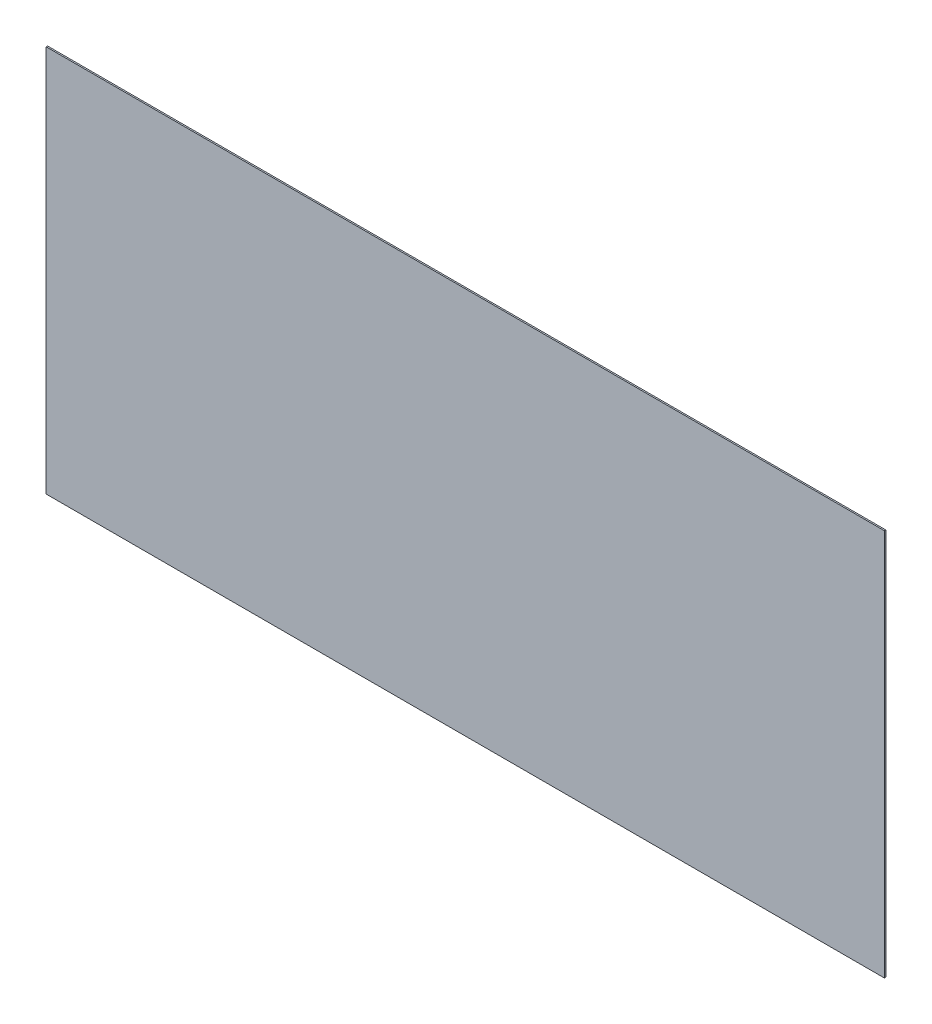
ISO-10303-21;
HEADER;
FILE_DESCRIPTION(('STEP AP214'),'2;1');
FILE_NAME('part.step','',(''),(''),'','','');
FILE_SCHEMA(('AUTOMOTIVE_DESIGN { 1 0 10303 214 1 1 1 1 }'));
ENDSEC;
DATA;
#1=APPLICATION_CONTEXT('core data for automotive mechanical design processes');
#2=APPLICATION_PROTOCOL_DEFINITION('international standard','automotive_design',2000,#1);
#3=PRODUCT_CONTEXT('',#1,'mechanical');
#4=PRODUCT('Part','Part','',(#3));
#5=PRODUCT_RELATED_PRODUCT_CATEGORY('part','',(#4));
#6=PRODUCT_DEFINITION_FORMATION('','',#4);
#7=PRODUCT_DEFINITION_CONTEXT('part definition',#1,'design');
#8=PRODUCT_DEFINITION('design','',#6,#7);
#9=PRODUCT_DEFINITION_SHAPE('','',#8);
#10=(LENGTH_UNIT() NAMED_UNIT(*) SI_UNIT(.MILLI.,.METRE.));
#11=(NAMED_UNIT(*) PLANE_ANGLE_UNIT() SI_UNIT($,.RADIAN.));
#12=(NAMED_UNIT(*) SI_UNIT($,.STERADIAN.) SOLID_ANGLE_UNIT());
#13=UNCERTAINTY_MEASURE_WITH_UNIT(LENGTH_MEASURE(1.E-05),#10,'distance_accuracy_value','');
#14=(GEOMETRIC_REPRESENTATION_CONTEXT(3) GLOBAL_UNCERTAINTY_ASSIGNED_CONTEXT((#13)) GLOBAL_UNIT_ASSIGNED_CONTEXT((#10,
#11,#12)) REPRESENTATION_CONTEXT('',''));
#15=CARTESIAN_POINT('',(0.,0.,0.));
#16=DIRECTION('',(0.,0.,1.));
#17=DIRECTION('',(1.,0.,0.));
#18=AXIS2_PLACEMENT_3D('',#15,#16,#17);
#19=CARTESIAN_POINT('',(16.,35.25,0.1));
#20=DIRECTION('',(1.,0.,0.));
#21=DIRECTION('',(0.,1.,0.));
#22=AXIS2_PLACEMENT_3D('',#19,#20,#21);
#23=PLANE('',#22);
#24=DIRECTION('',(0.,-1.,0.));
#25=VECTOR('',#24,1.);
#26=CARTESIAN_POINT('',(16.,35.25,0.));
#27=LINE('',#26,#25);
#28=CARTESIAN_POINT('',(16.,35.25,0.));
#29=VERTEX_POINT('',#28);
#30=CARTESIAN_POINT('',(16.,7.75000000000002,0.));
#31=VERTEX_POINT('',#30);
#32=EDGE_CURVE('E104',#29,#31,#27,.T.);
#33=ORIENTED_EDGE('',*,*,#32,.T.);
#34=DIRECTION('',(0.,0.,-1.));
#35=VECTOR('',#34,1.);
#36=CARTESIAN_POINT('',(16.,7.75000000000002,0.1));
#37=LINE('',#36,#35);
#38=CARTESIAN_POINT('',(16.,7.75000000000002,0.1));
#39=VERTEX_POINT('',#38);
#40=EDGE_CURVE('E11',#39,#31,#37,.T.);
#41=ORIENTED_EDGE('',*,*,#40,.F.);
#42=DIRECTION('',(0.,-1.,0.));
#43=VECTOR('',#42,1.);
#44=CARTESIAN_POINT('',(16.,35.25,0.1));
#45=LINE('',#44,#43);
#46=CARTESIAN_POINT('',(16.,35.25,0.1));
#47=VERTEX_POINT('',#46);
#48=EDGE_CURVE('E92',#47,#39,#45,.T.);
#49=ORIENTED_EDGE('',*,*,#48,.F.);
#50=DIRECTION('',(0.,0.,-1.));
#51=VECTOR('',#50,1.);
#52=CARTESIAN_POINT('',(16.,35.25,0.1));
#53=LINE('',#52,#51);
#54=EDGE_CURVE('E100',#47,#29,#53,.T.);
#55=ORIENTED_EDGE('',*,*,#54,.T.);
#56=EDGE_LOOP('',(#33,#41,#49,#55));
#57=FACE_BOUND('',#56,.T.);
#58=ADVANCED_FACE('F41',(#57),#23,.F.);
#59=CARTESIAN_POINT('',(16.,7.75000000000002,0.1));
#60=DIRECTION('',(0.,1.,0.));
#61=DIRECTION('',(0.,0.,1.));
#62=AXIS2_PLACEMENT_3D('',#59,#60,#61);
#63=PLANE('',#62);
#64=DIRECTION('',(1.,0.,0.));
#65=VECTOR('',#64,1.);
#66=CARTESIAN_POINT('',(16.,7.75000000000002,0.));
#67=LINE('',#66,#65);
#68=CARTESIAN_POINT('',(75.5,7.75000000000002,0.));
#69=VERTEX_POINT('',#68);
#70=EDGE_CURVE('E96',#31,#69,#67,.T.);
#71=ORIENTED_EDGE('',*,*,#70,.T.);
#72=DIRECTION('',(0.,0.,-1.));
#73=VECTOR('',#72,1.);
#74=CARTESIAN_POINT('',(75.5,7.75000000000002,0.1));
#75=LINE('',#74,#73);
#76=CARTESIAN_POINT('',(75.5,7.75000000000002,0.1));
#77=VERTEX_POINT('',#76);
#78=EDGE_CURVE('E49',#77,#69,#75,.T.);
#79=ORIENTED_EDGE('',*,*,#78,.F.);
#80=DIRECTION('',(1.,0.,0.));
#81=VECTOR('',#80,1.);
#82=CARTESIAN_POINT('',(16.,7.75000000000002,0.1));
#83=LINE('',#82,#81);
#84=EDGE_CURVE('E87',#39,#77,#83,.T.);
#85=ORIENTED_EDGE('',*,*,#84,.F.);
#86=ORIENTED_EDGE('',*,*,#40,.T.);
#87=EDGE_LOOP('',(#71,#79,#85,#86));
#88=FACE_BOUND('',#87,.T.);
#89=ADVANCED_FACE('F95',(#88),#63,.F.);
#90=CARTESIAN_POINT('',(75.5,35.25,0.1));
#91=DIRECTION('',(-1.,0.,0.));
#92=DIRECTION('',(0.,0.,1.));
#93=AXIS2_PLACEMENT_3D('',#90,#91,#92);
#94=PLANE('',#93);
#95=DIRECTION('',(0.,1.,0.));
#96=VECTOR('',#95,1.);
#97=CARTESIAN_POINT('',(75.5,35.25,0.));
#98=LINE('',#97,#96);
#99=CARTESIAN_POINT('',(75.5,35.25,0.));
#100=VERTEX_POINT('',#99);
#101=EDGE_CURVE('E74',#69,#100,#98,.T.);
#102=ORIENTED_EDGE('',*,*,#101,.T.);
#103=DIRECTION('',(0.,0.,-1.));
#104=VECTOR('',#103,1.);
#105=CARTESIAN_POINT('',(75.5,35.25,0.1));
#106=LINE('',#105,#104);
#107=CARTESIAN_POINT('',(75.5,35.25,0.1));
#108=VERTEX_POINT('',#107);
#109=EDGE_CURVE('E97',#108,#100,#106,.T.);
#110=ORIENTED_EDGE('',*,*,#109,.F.);
#111=DIRECTION('',(0.,1.,0.));
#112=VECTOR('',#111,1.);
#113=CARTESIAN_POINT('',(75.5,35.25,0.1));
#114=LINE('',#113,#112);
#115=EDGE_CURVE('E90',#77,#108,#114,.T.);
#116=ORIENTED_EDGE('',*,*,#115,.F.);
#117=ORIENTED_EDGE('',*,*,#78,.T.);
#118=EDGE_LOOP('',(#102,#110,#116,#117));
#119=FACE_BOUND('',#118,.T.);
#120=ADVANCED_FACE('F98',(#119),#94,.F.);
#121=CARTESIAN_POINT('',(16.,35.25,0.1));
#122=DIRECTION('',(0.,-1.,0.));
#123=DIRECTION('',(0.,0.,-1.));
#124=AXIS2_PLACEMENT_3D('',#121,#122,#123);
#125=PLANE('',#124);
#126=DIRECTION('',(-1.,0.,0.));
#127=VECTOR('',#126,1.);
#128=CARTESIAN_POINT('',(16.,35.25,0.));
#129=LINE('',#128,#127);
#130=EDGE_CURVE('E80',#100,#29,#129,.T.);
#131=ORIENTED_EDGE('',*,*,#130,.T.);
#132=ORIENTED_EDGE('',*,*,#54,.F.);
#133=DIRECTION('',(-1.,0.,0.));
#134=VECTOR('',#133,1.);
#135=CARTESIAN_POINT('',(16.,35.25,0.1));
#136=LINE('',#135,#134);
#137=EDGE_CURVE('E57',#108,#47,#136,.T.);
#138=ORIENTED_EDGE('',*,*,#137,.F.);
#139=ORIENTED_EDGE('',*,*,#109,.T.);
#140=EDGE_LOOP('',(#131,#132,#138,#139));
#141=FACE_BOUND('',#140,.T.);
#142=ADVANCED_FACE('F111',(#141),#125,.F.);
#143=CARTESIAN_POINT('',(16.,7.75000000000002,0.1));
#144=DIRECTION('',(0.,0.,1.));
#145=DIRECTION('',(1.,0.,0.));
#146=AXIS2_PLACEMENT_3D('',#143,#144,#145);
#147=PLANE('',#146);
#148=ORIENTED_EDGE('',*,*,#48,.T.);
#149=ORIENTED_EDGE('',*,*,#84,.T.);
#150=ORIENTED_EDGE('',*,*,#115,.T.);
#151=ORIENTED_EDGE('',*,*,#137,.T.);
#152=EDGE_LOOP('',(#148,#149,#150,#151));
#153=FACE_BOUND('',#152,.T.);
#154=ADVANCED_FACE('F88',(#153),#147,.T.);
#155=CARTESIAN_POINT('',(16.,7.75000000000002,0.));
#156=DIRECTION('',(0.,0.,1.));
#157=DIRECTION('',(1.,0.,0.));
#158=AXIS2_PLACEMENT_3D('',#155,#156,#157);
#159=PLANE('',#158);
#160=ORIENTED_EDGE('',*,*,#32,.F.);
#161=ORIENTED_EDGE('',*,*,#130,.F.);
#162=ORIENTED_EDGE('',*,*,#101,.F.);
#163=ORIENTED_EDGE('',*,*,#70,.F.);
#164=EDGE_LOOP('',(#160,#161,#162,#163));
#165=FACE_BOUND('',#164,.T.);
#166=ADVANCED_FACE('F114',(#165),#159,.F.);
#167=CLOSED_SHELL('',(#58,#89,#120,#142,#154,#166));
#168=MANIFOLD_SOLID_BREP('B2',#167);
#169=ADVANCED_BREP_SHAPE_REPRESENTATION('',(#18,#168),#14);
#170=SHAPE_DEFINITION_REPRESENTATION(#9,#169);
ENDSEC;
END-ISO-10303-21;
